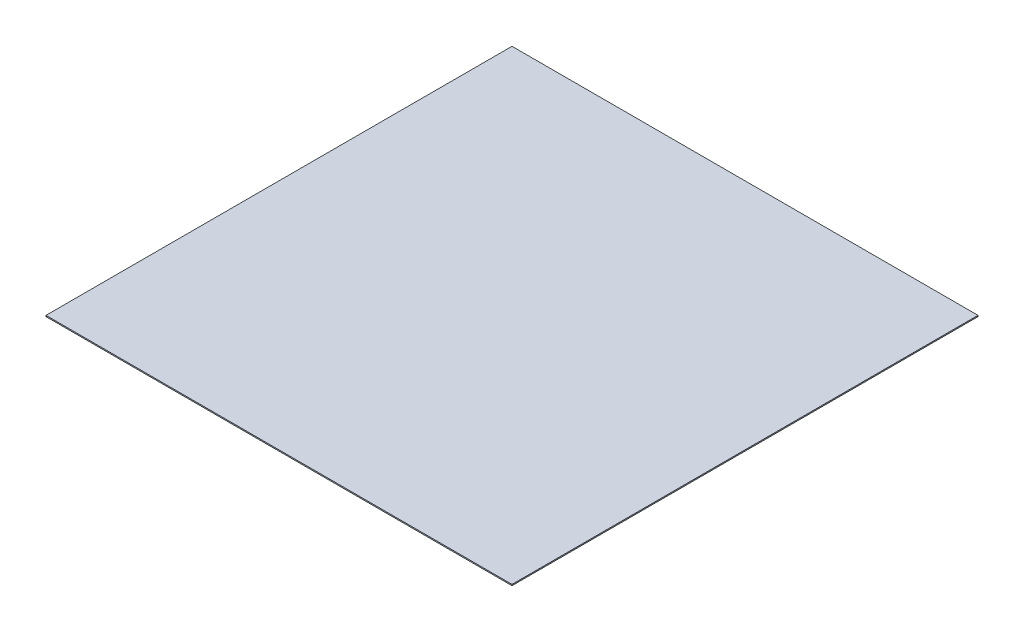
ISO-10303-21;
HEADER;
FILE_DESCRIPTION(('STEP AP214'),'2;1');
FILE_NAME('part.step','',(''),(''),'','','');
FILE_SCHEMA(('AUTOMOTIVE_DESIGN { 1 0 10303 214 1 1 1 1 }'));
ENDSEC;
DATA;
#1=APPLICATION_CONTEXT('core data for automotive mechanical design processes');
#2=APPLICATION_PROTOCOL_DEFINITION('international standard','automotive_design',2000,#1);
#3=PRODUCT_CONTEXT('',#1,'mechanical');
#4=PRODUCT('Part','Part','',(#3));
#5=PRODUCT_RELATED_PRODUCT_CATEGORY('part','',(#4));
#6=PRODUCT_DEFINITION_FORMATION('','',#4);
#7=PRODUCT_DEFINITION_CONTEXT('part definition',#1,'design');
#8=PRODUCT_DEFINITION('design','',#6,#7);
#9=PRODUCT_DEFINITION_SHAPE('','',#8);
#10=(LENGTH_UNIT() NAMED_UNIT(*) SI_UNIT(.MILLI.,.METRE.));
#11=(NAMED_UNIT(*) PLANE_ANGLE_UNIT() SI_UNIT($,.RADIAN.));
#12=(NAMED_UNIT(*) SI_UNIT($,.STERADIAN.) SOLID_ANGLE_UNIT());
#13=UNCERTAINTY_MEASURE_WITH_UNIT(LENGTH_MEASURE(1.E-05),#10,'distance_accuracy_value','');
#14=(GEOMETRIC_REPRESENTATION_CONTEXT(3) GLOBAL_UNCERTAINTY_ASSIGNED_CONTEXT((#13)) GLOBAL_UNIT_ASSIGNED_CONTEXT((#10,
#11,#12)) REPRESENTATION_CONTEXT('',''));
#15=CARTESIAN_POINT('',(0.,0.,0.));
#16=DIRECTION('',(0.,0.,1.));
#17=DIRECTION('',(1.,0.,0.));
#18=AXIS2_PLACEMENT_3D('',#15,#16,#17);
#19=CARTESIAN_POINT('',(0.,1.,0.));
#20=DIRECTION('',(1.,0.,0.));
#21=DIRECTION('',(0.,0.,-1.));
#22=AXIS2_PLACEMENT_3D('',#19,#20,#21);
#23=PLANE('',#22);
#24=DIRECTION('',(0.,0.,1.));
#25=VECTOR('',#24,1.);
#26=CARTESIAN_POINT('',(0.,0.,0.));
#27=LINE('',#26,#25);
#28=CARTESIAN_POINT('',(0.,0.,0.));
#29=VERTEX_POINT('',#28);
#30=CARTESIAN_POINT('',(0.,0.,400.));
#31=VERTEX_POINT('',#30);
#32=EDGE_CURVE('E98',#29,#31,#27,.T.);
#33=ORIENTED_EDGE('',*,*,#32,.T.);
#34=DIRECTION('',(0.,-1.,0.));
#35=VECTOR('',#34,1.);
#36=CARTESIAN_POINT('',(0.,1.,400.));
#37=LINE('',#36,#35);
#38=CARTESIAN_POINT('',(0.,1.,400.));
#39=VERTEX_POINT('',#38);
#40=EDGE_CURVE('E11',#39,#31,#37,.T.);
#41=ORIENTED_EDGE('',*,*,#40,.F.);
#42=DIRECTION('',(0.,0.,1.));
#43=VECTOR('',#42,1.);
#44=CARTESIAN_POINT('',(0.,1.,0.));
#45=LINE('',#44,#43);
#46=CARTESIAN_POINT('',(0.,1.,0.));
#47=VERTEX_POINT('',#46);
#48=EDGE_CURVE('E86',#47,#39,#45,.T.);
#49=ORIENTED_EDGE('',*,*,#48,.F.);
#50=DIRECTION('',(0.,-1.,0.));
#51=VECTOR('',#50,1.);
#52=CARTESIAN_POINT('',(0.,1.,0.));
#53=LINE('',#52,#51);
#54=EDGE_CURVE('E94',#47,#29,#53,.T.);
#55=ORIENTED_EDGE('',*,*,#54,.T.);
#56=EDGE_LOOP('',(#33,#41,#49,#55));
#57=FACE_BOUND('',#56,.T.);
#58=ADVANCED_FACE('F35',(#57),#23,.F.);
#59=CARTESIAN_POINT('',(0.,1.,400.));
#60=DIRECTION('',(0.,0.,-1.));
#61=DIRECTION('',(-1.,0.,0.));
#62=AXIS2_PLACEMENT_3D('',#59,#60,#61);
#63=PLANE('',#62);
#64=DIRECTION('',(1.,0.,0.));
#65=VECTOR('',#64,1.);
#66=CARTESIAN_POINT('',(0.,0.,400.));
#67=LINE('',#66,#65);
#68=CARTESIAN_POINT('',(400.,0.,400.));
#69=VERTEX_POINT('',#68);
#70=EDGE_CURVE('E90',#31,#69,#67,.T.);
#71=ORIENTED_EDGE('',*,*,#70,.T.);
#72=DIRECTION('',(0.,-1.,0.));
#73=VECTOR('',#72,1.);
#74=CARTESIAN_POINT('',(400.,1.,400.));
#75=LINE('',#74,#73);
#76=CARTESIAN_POINT('',(400.,1.,400.));
#77=VERTEX_POINT('',#76);
#78=EDGE_CURVE('E43',#77,#69,#75,.T.);
#79=ORIENTED_EDGE('',*,*,#78,.F.);
#80=DIRECTION('',(1.,0.,0.));
#81=VECTOR('',#80,1.);
#82=CARTESIAN_POINT('',(0.,1.,400.));
#83=LINE('',#82,#81);
#84=EDGE_CURVE('E81',#39,#77,#83,.T.);
#85=ORIENTED_EDGE('',*,*,#84,.F.);
#86=ORIENTED_EDGE('',*,*,#40,.T.);
#87=EDGE_LOOP('',(#71,#79,#85,#86));
#88=FACE_BOUND('',#87,.T.);
#89=ADVANCED_FACE('F89',(#88),#63,.F.);
#90=CARTESIAN_POINT('',(400.,1.,0.));
#91=DIRECTION('',(-1.,0.,0.));
#92=DIRECTION('',(0.,0.,1.));
#93=AXIS2_PLACEMENT_3D('',#90,#91,#92);
#94=PLANE('',#93);
#95=DIRECTION('',(0.,0.,-1.));
#96=VECTOR('',#95,1.);
#97=CARTESIAN_POINT('',(400.,0.,0.));
#98=LINE('',#97,#96);
#99=CARTESIAN_POINT('',(400.,0.,0.));
#100=VERTEX_POINT('',#99);
#101=EDGE_CURVE('E68',#69,#100,#98,.T.);
#102=ORIENTED_EDGE('',*,*,#101,.T.);
#103=DIRECTION('',(0.,-1.,0.));
#104=VECTOR('',#103,1.);
#105=CARTESIAN_POINT('',(400.,1.,0.));
#106=LINE('',#105,#104);
#107=CARTESIAN_POINT('',(400.,1.,0.));
#108=VERTEX_POINT('',#107);
#109=EDGE_CURVE('E91',#108,#100,#106,.T.);
#110=ORIENTED_EDGE('',*,*,#109,.F.);
#111=DIRECTION('',(0.,0.,-1.));
#112=VECTOR('',#111,1.);
#113=CARTESIAN_POINT('',(400.,1.,0.));
#114=LINE('',#113,#112);
#115=EDGE_CURVE('E84',#77,#108,#114,.T.);
#116=ORIENTED_EDGE('',*,*,#115,.F.);
#117=ORIENTED_EDGE('',*,*,#78,.T.);
#118=EDGE_LOOP('',(#102,#110,#116,#117));
#119=FACE_BOUND('',#118,.T.);
#120=ADVANCED_FACE('F92',(#119),#94,.F.);
#121=CARTESIAN_POINT('',(0.,1.,0.));
#122=DIRECTION('',(0.,0.,1.));
#123=DIRECTION('',(1.,0.,0.));
#124=AXIS2_PLACEMENT_3D('',#121,#122,#123);
#125=PLANE('',#124);
#126=DIRECTION('',(-1.,0.,0.));
#127=VECTOR('',#126,1.);
#128=CARTESIAN_POINT('',(0.,0.,0.));
#129=LINE('',#128,#127);
#130=EDGE_CURVE('E74',#100,#29,#129,.T.);
#131=ORIENTED_EDGE('',*,*,#130,.T.);
#132=ORIENTED_EDGE('',*,*,#54,.F.);
#133=DIRECTION('',(-1.,0.,0.));
#134=VECTOR('',#133,1.);
#135=CARTESIAN_POINT('',(0.,1.,0.));
#136=LINE('',#135,#134);
#137=EDGE_CURVE('E51',#108,#47,#136,.T.);
#138=ORIENTED_EDGE('',*,*,#137,.F.);
#139=ORIENTED_EDGE('',*,*,#109,.T.);
#140=EDGE_LOOP('',(#131,#132,#138,#139));
#141=FACE_BOUND('',#140,.T.);
#142=ADVANCED_FACE('F105',(#141),#125,.F.);
#143=CARTESIAN_POINT('',(0.,1.,0.));
#144=DIRECTION('',(0.,1.,0.));
#145=DIRECTION('',(0.,0.,1.));
#146=AXIS2_PLACEMENT_3D('',#143,#144,#145);
#147=PLANE('',#146);
#148=ORIENTED_EDGE('',*,*,#48,.T.);
#149=ORIENTED_EDGE('',*,*,#84,.T.);
#150=ORIENTED_EDGE('',*,*,#115,.T.);
#151=ORIENTED_EDGE('',*,*,#137,.T.);
#152=EDGE_LOOP('',(#148,#149,#150,#151));
#153=FACE_BOUND('',#152,.T.);
#154=ADVANCED_FACE('F82',(#153),#147,.T.);
#155=CARTESIAN_POINT('',(0.,0.,0.));
#156=DIRECTION('',(0.,1.,0.));
#157=DIRECTION('',(0.,0.,1.));
#158=AXIS2_PLACEMENT_3D('',#155,#156,#157);
#159=PLANE('',#158);
#160=ORIENTED_EDGE('',*,*,#32,.F.);
#161=ORIENTED_EDGE('',*,*,#130,.F.);
#162=ORIENTED_EDGE('',*,*,#101,.F.);
#163=ORIENTED_EDGE('',*,*,#70,.F.);
#164=EDGE_LOOP('',(#160,#161,#162,#163));
#165=FACE_BOUND('',#164,.T.);
#166=ADVANCED_FACE('F108',(#165),#159,.F.);
#167=CLOSED_SHELL('',(#58,#89,#120,#142,#154,#166));
#168=MANIFOLD_SOLID_BREP('B2',#167);
#169=ADVANCED_BREP_SHAPE_REPRESENTATION('',(#18,#168),#14);
#170=SHAPE_DEFINITION_REPRESENTATION(#9,#169);
ENDSEC;
END-ISO-10303-21;
